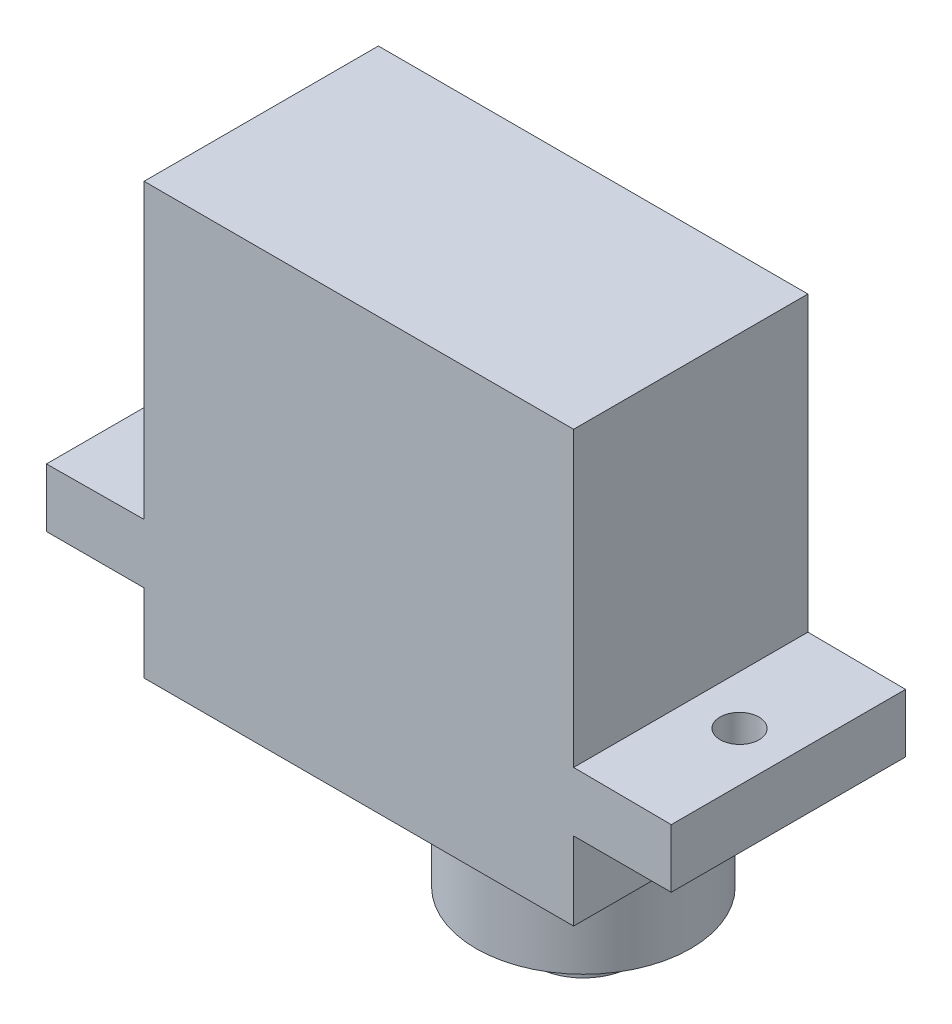
ISO-10303-21;
HEADER;
FILE_DESCRIPTION(('STEP AP214'),'2;1');
FILE_NAME('part.step','',(''),(''),'','','');
FILE_SCHEMA(('AUTOMOTIVE_DESIGN { 1 0 10303 214 1 1 1 1 }'));
ENDSEC;
DATA;
#1=APPLICATION_CONTEXT('core data for automotive mechanical design processes');
#2=APPLICATION_PROTOCOL_DEFINITION('international standard','automotive_design',2000,#1);
#3=PRODUCT_CONTEXT('',#1,'mechanical');
#4=PRODUCT('Part','Part','',(#3));
#5=PRODUCT_RELATED_PRODUCT_CATEGORY('part','',(#4));
#6=PRODUCT_DEFINITION_FORMATION('','',#4);
#7=PRODUCT_DEFINITION_CONTEXT('part definition',#1,'design');
#8=PRODUCT_DEFINITION('design','',#6,#7);
#9=PRODUCT_DEFINITION_SHAPE('','',#8);
#10=(LENGTH_UNIT() NAMED_UNIT(*) SI_UNIT(.MILLI.,.METRE.));
#11=(NAMED_UNIT(*) PLANE_ANGLE_UNIT() SI_UNIT($,.RADIAN.));
#12=(NAMED_UNIT(*) SI_UNIT($,.STERADIAN.) SOLID_ANGLE_UNIT());
#13=UNCERTAINTY_MEASURE_WITH_UNIT(LENGTH_MEASURE(1.E-05),#10,'distance_accuracy_value','');
#14=(GEOMETRIC_REPRESENTATION_CONTEXT(3) GLOBAL_UNCERTAINTY_ASSIGNED_CONTEXT((#13)) GLOBAL_UNIT_ASSIGNED_CONTEXT((#10,
#11,#12)) REPRESENTATION_CONTEXT('',''));
#15=CARTESIAN_POINT('',(0.,0.,0.));
#16=DIRECTION('',(0.,0.,1.));
#17=DIRECTION('',(1.,0.,0.));
#18=AXIS2_PLACEMENT_3D('',#15,#16,#17);
#19=CARTESIAN_POINT('',(11.,-7.5,12.));
#20=DIRECTION('',(-1.,0.,0.));
#21=DIRECTION('',(0.,0.,1.));
#22=AXIS2_PLACEMENT_3D('',#19,#20,#21);
#23=PLANE('',#22);
#24=DIRECTION('',(0.,1.,0.));
#25=VECTOR('',#24,1.);
#26=CARTESIAN_POINT('',(11.,-7.5,0.));
#27=LINE('',#26,#25);
#28=CARTESIAN_POINT('',(11.,-7.5,0.));
#29=VERTEX_POINT('',#28);
#30=CARTESIAN_POINT('',(11.,7.5,0.));
#31=VERTEX_POINT('',#30);
#32=EDGE_CURVE('E154',#29,#31,#27,.T.);
#33=ORIENTED_EDGE('',*,*,#32,.T.);
#34=DIRECTION('',(0.,0.,-1.));
#35=VECTOR('',#34,1.);
#36=CARTESIAN_POINT('',(11.,7.5,12.));
#37=LINE('',#36,#35);
#38=CARTESIAN_POINT('',(11.,7.5,12.));
#39=VERTEX_POINT('',#38);
#40=EDGE_CURVE('E12',#39,#31,#37,.T.);
#41=ORIENTED_EDGE('',*,*,#40,.F.);
#42=DIRECTION('',(0.,1.,0.));
#43=VECTOR('',#42,1.);
#44=CARTESIAN_POINT('',(11.,-7.5,12.));
#45=LINE('',#44,#43);
#46=CARTESIAN_POINT('',(11.,-7.5,12.));
#47=VERTEX_POINT('',#46);
#48=EDGE_CURVE('E178',#47,#39,#45,.T.);
#49=ORIENTED_EDGE('',*,*,#48,.F.);
#50=DIRECTION('',(0.,0.,-1.));
#51=VECTOR('',#50,1.);
#52=CARTESIAN_POINT('',(11.,-7.5,12.));
#53=LINE('',#52,#51);
#54=EDGE_CURVE('E150',#47,#29,#53,.T.);
#55=ORIENTED_EDGE('',*,*,#54,.T.);
#56=EDGE_LOOP('',(#33,#41,#49,#55));
#57=FACE_BOUND('',#56,.T.);
#58=ADVANCED_FACE('F35',(#57),#23,.F.);
#59=CARTESIAN_POINT('',(-11.,7.5,12.));
#60=DIRECTION('',(0.,-1.,0.));
#61=DIRECTION('',(0.,0.,-1.));
#62=AXIS2_PLACEMENT_3D('',#59,#60,#61);
#63=PLANE('',#62);
#64=DIRECTION('',(-1.,0.,0.));
#65=VECTOR('',#64,1.);
#66=CARTESIAN_POINT('',(-11.,7.5,0.));
#67=LINE('',#66,#65);
#68=CARTESIAN_POINT('',(-11.,7.5,0.));
#69=VERTEX_POINT('',#68);
#70=EDGE_CURVE('E157',#31,#69,#67,.T.);
#71=ORIENTED_EDGE('',*,*,#70,.T.);
#72=DIRECTION('',(0.,0.,-1.));
#73=VECTOR('',#72,1.);
#74=CARTESIAN_POINT('',(-11.,7.5,12.));
#75=LINE('',#74,#73);
#76=CARTESIAN_POINT('',(-11.,7.5,12.));
#77=VERTEX_POINT('',#76);
#78=EDGE_CURVE('E44',#77,#69,#75,.T.);
#79=ORIENTED_EDGE('',*,*,#78,.F.);
#80=DIRECTION('',(-1.,0.,0.));
#81=VECTOR('',#80,1.);
#82=CARTESIAN_POINT('',(-11.,7.5,12.));
#83=LINE('',#82,#81);
#84=EDGE_CURVE('E105',#39,#77,#83,.T.);
#85=ORIENTED_EDGE('',*,*,#84,.F.);
#86=ORIENTED_EDGE('',*,*,#40,.T.);
#87=EDGE_LOOP('',(#71,#79,#85,#86));
#88=FACE_BOUND('',#87,.T.);
#89=ADVANCED_FACE('F267',(#88),#63,.F.);
#90=CARTESIAN_POINT('',(-11.,-7.5,12.));
#91=DIRECTION('',(1.,0.,0.));
#92=DIRECTION('',(0.,0.,-1.));
#93=AXIS2_PLACEMENT_3D('',#90,#91,#92);
#94=PLANE('',#93);
#95=DIRECTION('',(0.,-1.,0.));
#96=VECTOR('',#95,1.);
#97=CARTESIAN_POINT('',(-11.,-7.5,0.));
#98=LINE('',#97,#96);
#99=CARTESIAN_POINT('',(-11.,-7.5,0.));
#100=VERTEX_POINT('',#99);
#101=EDGE_CURVE('E160',#69,#100,#98,.T.);
#102=ORIENTED_EDGE('',*,*,#101,.T.);
#103=DIRECTION('',(0.,0.,-1.));
#104=VECTOR('',#103,1.);
#105=CARTESIAN_POINT('',(-11.,-7.5,12.));
#106=LINE('',#105,#104);
#107=CARTESIAN_POINT('',(-11.,-7.5,12.));
#108=VERTEX_POINT('',#107);
#109=EDGE_CURVE('E194',#108,#100,#106,.T.);
#110=ORIENTED_EDGE('',*,*,#109,.F.);
#111=DIRECTION('',(0.,-1.,0.));
#112=VECTOR('',#111,1.);
#113=CARTESIAN_POINT('',(-11.,-7.5,12.));
#114=LINE('',#113,#112);
#115=EDGE_CURVE('E203',#77,#108,#114,.T.);
#116=ORIENTED_EDGE('',*,*,#115,.F.);
#117=ORIENTED_EDGE('',*,*,#78,.T.);
#118=EDGE_LOOP('',(#102,#110,#116,#117));
#119=FACE_BOUND('',#118,.T.);
#120=ADVANCED_FACE('F201',(#119),#94,.F.);
#121=CARTESIAN_POINT('',(-16.,-7.53701079560618,12.));
#122=DIRECTION('',(0.00740195634016767,-0.99997260514593,0.));
#123=DIRECTION('',(0.99997260514593,0.00740195634016767,0.));
#124=AXIS2_PLACEMENT_3D('',#121,#122,#123);
#125=PLANE('',#124);
#126=CARTESIAN_POINT('',(-13.5,-7.51850539780309,6.));
#127=DIRECTION('',(0.00740195634016767,-0.99997260514593,0.));
#128=DIRECTION('',(-0.99997260514593,-0.00740195634016767,0.));
#129=AXIS2_PLACEMENT_3D('',#126,#127,#128);
#130=ELLIPSE('',#129,1.00002739560457,1.);
#131=CARTESIAN_POINT('',(-14.5,-7.52590755692433,6.));
#132=VERTEX_POINT('',#131);
#133=EDGE_CURVE('E317',#132,#132,#130,.T.);
#134=ORIENTED_EDGE('',*,*,#133,.T.);
#135=EDGE_LOOP('',(#134));
#136=FACE_BOUND('',#135,.T.);
#137=DIRECTION('',(-0.99997260514593,-0.00740195634016767,0.));
#138=VECTOR('',#137,1.);
#139=CARTESIAN_POINT('',(-16.,-7.53701079560618,0.));
#140=LINE('',#139,#138);
#141=CARTESIAN_POINT('',(-16.,-7.53701079560618,0.));
#142=VERTEX_POINT('',#141);
#143=EDGE_CURVE('E162',#100,#142,#140,.T.);
#144=ORIENTED_EDGE('',*,*,#143,.T.);
#145=DIRECTION('',(0.,0.,-1.));
#146=VECTOR('',#145,1.);
#147=CARTESIAN_POINT('',(-16.,-7.53701079560618,12.));
#148=LINE('',#147,#146);
#149=CARTESIAN_POINT('',(-16.,-7.53701079560618,12.));
#150=VERTEX_POINT('',#149);
#151=EDGE_CURVE('E191',#150,#142,#148,.T.);
#152=ORIENTED_EDGE('',*,*,#151,.F.);
#153=DIRECTION('',(-0.99997260514593,-0.00740195634016767,0.));
#154=VECTOR('',#153,1.);
#155=CARTESIAN_POINT('',(-16.,-7.53701079560618,12.));
#156=LINE('',#155,#154);
#157=EDGE_CURVE('E222',#108,#150,#156,.T.);
#158=ORIENTED_EDGE('',*,*,#157,.F.);
#159=ORIENTED_EDGE('',*,*,#109,.T.);
#160=EDGE_LOOP('',(#144,#152,#158,#159));
#161=FACE_BOUND('',#160,.T.);
#162=ADVANCED_FACE('F213',(#136,#161),#125,.F.);
#163=CARTESIAN_POINT('',(-16.,-7.53701079560618,12.));
#164=DIRECTION('',(1.,0.,0.));
#165=DIRECTION('',(0.,0.,-1.));
#166=AXIS2_PLACEMENT_3D('',#163,#164,#165);
#167=PLANE('',#166);
#168=DIRECTION('',(0.,-1.,0.));
#169=VECTOR('',#168,1.);
#170=CARTESIAN_POINT('',(-16.,-7.53701079560618,0.));
#171=LINE('',#170,#169);
#172=CARTESIAN_POINT('',(-16.,-10.5370107956062,0.));
#173=VERTEX_POINT('',#172);
#174=EDGE_CURVE('E164',#142,#173,#171,.T.);
#175=ORIENTED_EDGE('',*,*,#174,.T.);
#176=DIRECTION('',(0.,0.,-1.));
#177=VECTOR('',#176,1.);
#178=CARTESIAN_POINT('',(-16.,-10.5370107956062,12.));
#179=LINE('',#178,#177);
#180=CARTESIAN_POINT('',(-16.,-10.5370107956062,12.));
#181=VERTEX_POINT('',#180);
#182=EDGE_CURVE('E188',#181,#173,#179,.T.);
#183=ORIENTED_EDGE('',*,*,#182,.F.);
#184=DIRECTION('',(0.,-1.,0.));
#185=VECTOR('',#184,1.);
#186=CARTESIAN_POINT('',(-16.,-7.53701079560618,12.));
#187=LINE('',#186,#185);
#188=EDGE_CURVE('E219',#150,#181,#187,.T.);
#189=ORIENTED_EDGE('',*,*,#188,.F.);
#190=ORIENTED_EDGE('',*,*,#151,.T.);
#191=EDGE_LOOP('',(#175,#183,#189,#190));
#192=FACE_BOUND('',#191,.T.);
#193=ADVANCED_FACE('F217',(#192),#167,.F.);
#194=CARTESIAN_POINT('',(-16.,-10.5370107956062,12.));
#195=DIRECTION('',(0.,1.,0.));
#196=DIRECTION('',(-1.,0.,0.));
#197=AXIS2_PLACEMENT_3D('',#194,#195,#196);
#198=PLANE('',#197);
#199=CARTESIAN_POINT('',(-13.5,-10.5370107956062,6.));
#200=DIRECTION('',(0.,-1.,0.));
#201=DIRECTION('',(1.,0.,0.));
#202=AXIS2_PLACEMENT_3D('',#199,#200,#201);
#203=CIRCLE('',#202,1.);
#204=CARTESIAN_POINT('',(-12.5,-10.5370107956062,6.));
#205=VERTEX_POINT('',#204);
#206=EDGE_CURVE('E313',#205,#205,#203,.T.);
#207=ORIENTED_EDGE('',*,*,#206,.F.);
#208=EDGE_LOOP('',(#207));
#209=FACE_BOUND('',#208,.T.);
#210=DIRECTION('',(1.,0.,0.));
#211=VECTOR('',#210,1.);
#212=CARTESIAN_POINT('',(-16.,-10.5370107956062,0.));
#213=LINE('',#212,#211);
#214=CARTESIAN_POINT('',(-11.,-10.5370107956062,0.));
#215=VERTEX_POINT('',#214);
#216=EDGE_CURVE('E166',#173,#215,#213,.T.);
#217=ORIENTED_EDGE('',*,*,#216,.T.);
#218=DIRECTION('',(0.,0.,-1.));
#219=VECTOR('',#218,1.);
#220=CARTESIAN_POINT('',(-11.,-10.5370107956062,12.));
#221=LINE('',#220,#219);
#222=CARTESIAN_POINT('',(-11.,-10.5370107956062,12.));
#223=VERTEX_POINT('',#222);
#224=EDGE_CURVE('E185',#223,#215,#221,.T.);
#225=ORIENTED_EDGE('',*,*,#224,.F.);
#226=DIRECTION('',(1.,0.,0.));
#227=VECTOR('',#226,1.);
#228=CARTESIAN_POINT('',(-16.,-10.5370107956062,12.));
#229=LINE('',#228,#227);
#230=EDGE_CURVE('E221',#181,#223,#229,.T.);
#231=ORIENTED_EDGE('',*,*,#230,.F.);
#232=ORIENTED_EDGE('',*,*,#182,.T.);
#233=EDGE_LOOP('',(#217,#225,#231,#232));
#234=FACE_BOUND('',#233,.T.);
#235=ADVANCED_FACE('F281',(#209,#234),#198,.F.);
#236=CARTESIAN_POINT('',(-11.,-10.5370107956062,12.));
#237=DIRECTION('',(1.,0.,0.));
#238=DIRECTION('',(0.,1.,0.));
#239=AXIS2_PLACEMENT_3D('',#236,#237,#238);
#240=PLANE('',#239);
#241=DIRECTION('',(0.,-1.,0.));
#242=VECTOR('',#241,1.);
#243=CARTESIAN_POINT('',(-11.,-10.5370107956062,0.));
#244=LINE('',#243,#242);
#245=CARTESIAN_POINT('',(-11.,-14.5370107956062,0.));
#246=VERTEX_POINT('',#245);
#247=EDGE_CURVE('E168',#215,#246,#244,.T.);
#248=ORIENTED_EDGE('',*,*,#247,.T.);
#249=DIRECTION('',(0.,0.,-1.));
#250=VECTOR('',#249,1.);
#251=CARTESIAN_POINT('',(-11.,-14.5370107956062,12.));
#252=LINE('',#251,#250);
#253=CARTESIAN_POINT('',(-11.,-14.5370107956062,12.));
#254=VERTEX_POINT('',#253);
#255=EDGE_CURVE('E182',#254,#246,#252,.T.);
#256=ORIENTED_EDGE('',*,*,#255,.F.);
#257=DIRECTION('',(0.,-1.,0.));
#258=VECTOR('',#257,1.);
#259=CARTESIAN_POINT('',(-11.,-10.5370107956062,12.));
#260=LINE('',#259,#258);
#261=EDGE_CURVE('E224',#223,#254,#260,.T.);
#262=ORIENTED_EDGE('',*,*,#261,.F.);
#263=ORIENTED_EDGE('',*,*,#224,.T.);
#264=EDGE_LOOP('',(#248,#256,#262,#263));
#265=FACE_BOUND('',#264,.T.);
#266=ADVANCED_FACE('F284',(#265),#240,.F.);
#267=CARTESIAN_POINT('',(0.,-14.5370107956062,12.));
#268=DIRECTION('',(0.,1.,0.));
#269=DIRECTION('',(-1.,0.,0.));
#270=AXIS2_PLACEMENT_3D('',#267,#268,#269);
#271=PLANE('',#270);
#272=DIRECTION('',(1.,0.,0.));
#273=VECTOR('',#272,1.);
#274=CARTESIAN_POINT('',(0.,-14.5370107956062,0.));
#275=LINE('',#274,#273);
#276=CARTESIAN_POINT('',(11.,-14.5370107956062,0.));
#277=VERTEX_POINT('',#276);
#278=EDGE_CURVE('E170',#246,#277,#275,.T.);
#279=ORIENTED_EDGE('',*,*,#278,.T.);
#280=DIRECTION('',(0.,0.,-1.));
#281=VECTOR('',#280,1.);
#282=CARTESIAN_POINT('',(11.,-14.5370107956062,12.));
#283=LINE('',#282,#281);
#284=CARTESIAN_POINT('',(11.,-14.5370107956062,6.));
#285=VERTEX_POINT('',#284);
#286=EDGE_CURVE('E247',#285,#277,#283,.T.);
#287=ORIENTED_EDGE('',*,*,#286,.F.);
#288=CARTESIAN_POINT('',(5.50000000000001,-14.5370107956062,6.));
#289=DIRECTION('',(0.,1.,0.));
#290=DIRECTION('',(-1.,0.,0.));
#291=AXIS2_PLACEMENT_3D('',#288,#289,#290);
#292=CIRCLE('',#291,5.5);
#293=EDGE_CURVE('E244',#285,#285,#292,.F.);
#294=ORIENTED_EDGE('',*,*,#293,.F.);
#295=CARTESIAN_POINT('',(11.,-14.5370107956062,12.));
#296=VERTEX_POINT('',#295);
#297=EDGE_CURVE('E239',#296,#285,#283,.T.);
#298=ORIENTED_EDGE('',*,*,#297,.F.);
#299=DIRECTION('',(1.,0.,0.));
#300=VECTOR('',#299,1.);
#301=CARTESIAN_POINT('',(0.,-14.5370107956062,12.));
#302=LINE('',#301,#300);
#303=EDGE_CURVE('E230',#254,#296,#302,.T.);
#304=ORIENTED_EDGE('',*,*,#303,.F.);
#305=ORIENTED_EDGE('',*,*,#255,.T.);
#306=EDGE_LOOP('',(#279,#287,#294,#298,#304,#305));
#307=FACE_BOUND('',#306,.T.);
#308=ADVANCED_FACE('F240',(#307),#271,.F.);
#309=CARTESIAN_POINT('',(11.,-10.5370107956062,12.));
#310=DIRECTION('',(-1.,0.,0.));
#311=DIRECTION('',(0.,-1.,0.));
#312=AXIS2_PLACEMENT_3D('',#309,#310,#311);
#313=PLANE('',#312);
#314=DIRECTION('',(0.,1.,0.));
#315=VECTOR('',#314,1.);
#316=CARTESIAN_POINT('',(11.,-14.5370107956062,12.));
#317=LINE('',#316,#315);
#318=CARTESIAN_POINT('',(11.,-10.5370107956062,12.));
#319=VERTEX_POINT('',#318);
#320=EDGE_CURVE('E136',#296,#319,#317,.T.);
#321=ORIENTED_EDGE('',*,*,#320,.F.);
#322=ORIENTED_EDGE('',*,*,#297,.T.);
#323=ORIENTED_EDGE('',*,*,#286,.T.);
#324=DIRECTION('',(0.,1.,0.));
#325=VECTOR('',#324,1.);
#326=CARTESIAN_POINT('',(11.,-10.5370107956062,0.));
#327=LINE('',#326,#325);
#328=CARTESIAN_POINT('',(11.,-10.5370107956062,0.));
#329=VERTEX_POINT('',#328);
#330=EDGE_CURVE('E173',#277,#329,#327,.T.);
#331=ORIENTED_EDGE('',*,*,#330,.T.);
#332=DIRECTION('',(0.,0.,-1.));
#333=VECTOR('',#332,1.);
#334=CARTESIAN_POINT('',(11.,-10.5370107956062,12.));
#335=LINE('',#334,#333);
#336=EDGE_CURVE('E145',#319,#329,#335,.T.);
#337=ORIENTED_EDGE('',*,*,#336,.F.);
#338=EDGE_LOOP('',(#321,#322,#323,#331,#337));
#339=FACE_BOUND('',#338,.T.);
#340=ADVANCED_FACE('F249',(#339),#313,.F.);
#341=CARTESIAN_POINT('',(11.,-10.5370107956062,12.));
#342=DIRECTION('',(0.,1.,0.));
#343=DIRECTION('',(-1.,0.,0.));
#344=AXIS2_PLACEMENT_3D('',#341,#342,#343);
#345=PLANE('',#344);
#346=CARTESIAN_POINT('',(13.5,-10.5370107956062,6.));
#347=DIRECTION('',(0.,-1.,0.));
#348=DIRECTION('',(-1.,0.,0.));
#349=AXIS2_PLACEMENT_3D('',#346,#347,#348);
#350=CIRCLE('',#349,1.);
#351=CARTESIAN_POINT('',(12.5,-10.5370107956062,6.));
#352=VERTEX_POINT('',#351);
#353=EDGE_CURVE('E310',#352,#352,#350,.T.);
#354=ORIENTED_EDGE('',*,*,#353,.F.);
#355=EDGE_LOOP('',(#354));
#356=FACE_BOUND('',#355,.T.);
#357=DIRECTION('',(1.,0.,0.));
#358=VECTOR('',#357,1.);
#359=CARTESIAN_POINT('',(11.,-10.5370107956062,0.));
#360=LINE('',#359,#358);
#361=CARTESIAN_POINT('',(16.,-10.5370107956062,0.));
#362=VERTEX_POINT('',#361);
#363=EDGE_CURVE('E144',#329,#362,#360,.T.);
#364=ORIENTED_EDGE('',*,*,#363,.T.);
#365=DIRECTION('',(0.,0.,-1.));
#366=VECTOR('',#365,1.);
#367=CARTESIAN_POINT('',(16.,-10.5370107956062,12.));
#368=LINE('',#367,#366);
#369=CARTESIAN_POINT('',(16.,-10.5370107956062,12.));
#370=VERTEX_POINT('',#369);
#371=EDGE_CURVE('E141',#370,#362,#368,.T.);
#372=ORIENTED_EDGE('',*,*,#371,.F.);
#373=DIRECTION('',(1.,0.,0.));
#374=VECTOR('',#373,1.);
#375=CARTESIAN_POINT('',(11.,-10.5370107956062,12.));
#376=LINE('',#375,#374);
#377=EDGE_CURVE('E129',#319,#370,#376,.T.);
#378=ORIENTED_EDGE('',*,*,#377,.F.);
#379=ORIENTED_EDGE('',*,*,#336,.T.);
#380=EDGE_LOOP('',(#364,#372,#378,#379));
#381=FACE_BOUND('',#380,.T.);
#382=ADVANCED_FACE('F142',(#356,#381),#345,.F.);
#383=CARTESIAN_POINT('',(16.,-7.53701079560618,12.));
#384=DIRECTION('',(-1.,0.,0.));
#385=DIRECTION('',(0.,0.,1.));
#386=AXIS2_PLACEMENT_3D('',#383,#384,#385);
#387=PLANE('',#386);
#388=DIRECTION('',(0.,1.,0.));
#389=VECTOR('',#388,1.);
#390=CARTESIAN_POINT('',(16.,-7.53701079560618,0.));
#391=LINE('',#390,#389);
#392=CARTESIAN_POINT('',(16.,-7.53701079560618,0.));
#393=VERTEX_POINT('',#392);
#394=EDGE_CURVE('E91',#362,#393,#391,.T.);
#395=ORIENTED_EDGE('',*,*,#394,.T.);
#396=DIRECTION('',(0.,0.,-1.));
#397=VECTOR('',#396,1.);
#398=CARTESIAN_POINT('',(16.,-7.53701079560618,12.));
#399=LINE('',#398,#397);
#400=CARTESIAN_POINT('',(16.,-7.53701079560618,12.));
#401=VERTEX_POINT('',#400);
#402=EDGE_CURVE('E146',#401,#393,#399,.T.);
#403=ORIENTED_EDGE('',*,*,#402,.F.);
#404=DIRECTION('',(0.,1.,0.));
#405=VECTOR('',#404,1.);
#406=CARTESIAN_POINT('',(16.,-7.53701079560618,12.));
#407=LINE('',#406,#405);
#408=EDGE_CURVE('E134',#370,#401,#407,.T.);
#409=ORIENTED_EDGE('',*,*,#408,.F.);
#410=ORIENTED_EDGE('',*,*,#371,.T.);
#411=EDGE_LOOP('',(#395,#403,#409,#410));
#412=FACE_BOUND('',#411,.T.);
#413=ADVANCED_FACE('F148',(#412),#387,.F.);
#414=CARTESIAN_POINT('',(11.,-7.5,12.));
#415=DIRECTION('',(-0.00740195634016681,-0.99997260514593,0.));
#416=DIRECTION('',(0.99997260514593,-0.00740195634016682,0.));
#417=AXIS2_PLACEMENT_3D('',#414,#415,#416);
#418=PLANE('',#417);
#419=CARTESIAN_POINT('',(13.5,-7.51850539780309,6.));
#420=DIRECTION('',(-0.00740195634016681,-0.99997260514593,0.));
#421=DIRECTION('',(0.99997260514593,-0.00740195634016682,0.));
#422=AXIS2_PLACEMENT_3D('',#419,#420,#421);
#423=ELLIPSE('',#422,1.00002739560457,1.);
#424=CARTESIAN_POINT('',(14.5,-7.52590755692432,6.));
#425=VERTEX_POINT('',#424);
#426=EDGE_CURVE('E38',#425,#425,#423,.T.);
#427=ORIENTED_EDGE('',*,*,#426,.T.);
#428=EDGE_LOOP('',(#427));
#429=FACE_BOUND('',#428,.T.);
#430=DIRECTION('',(-0.99997260514593,0.00740195634016682,0.));
#431=VECTOR('',#430,1.);
#432=CARTESIAN_POINT('',(11.,-7.5,0.));
#433=LINE('',#432,#431);
#434=EDGE_CURVE('E97',#393,#29,#433,.T.);
#435=ORIENTED_EDGE('',*,*,#434,.T.);
#436=ORIENTED_EDGE('',*,*,#54,.F.);
#437=DIRECTION('',(-0.99997260514593,0.00740195634016682,0.));
#438=VECTOR('',#437,1.);
#439=CARTESIAN_POINT('',(11.,-7.5,12.));
#440=LINE('',#439,#438);
#441=EDGE_CURVE('E52',#401,#47,#440,.T.);
#442=ORIENTED_EDGE('',*,*,#441,.F.);
#443=ORIENTED_EDGE('',*,*,#402,.T.);
#444=EDGE_LOOP('',(#435,#436,#442,#443));
#445=FACE_BOUND('',#444,.T.);
#446=ADVANCED_FACE('F254',(#429,#445),#418,.F.);
#447=CARTESIAN_POINT('',(0.,0.,12.));
#448=DIRECTION('',(0.,0.,-1.));
#449=DIRECTION('',(-1.,0.,0.));
#450=AXIS2_PLACEMENT_3D('',#447,#448,#449);
#451=PLANE('',#450);
#452=ORIENTED_EDGE('',*,*,#303,.T.);
#453=ORIENTED_EDGE('',*,*,#320,.T.);
#454=ORIENTED_EDGE('',*,*,#377,.T.);
#455=ORIENTED_EDGE('',*,*,#408,.T.);
#456=ORIENTED_EDGE('',*,*,#441,.T.);
#457=ORIENTED_EDGE('',*,*,#48,.T.);
#458=ORIENTED_EDGE('',*,*,#84,.T.);
#459=ORIENTED_EDGE('',*,*,#115,.T.);
#460=ORIENTED_EDGE('',*,*,#157,.T.);
#461=ORIENTED_EDGE('',*,*,#188,.T.);
#462=ORIENTED_EDGE('',*,*,#230,.T.);
#463=ORIENTED_EDGE('',*,*,#261,.T.);
#464=EDGE_LOOP('',(#452,#453,#454,#455,#456,#457,#458,#459,#460,#461,#462,#463));
#465=FACE_BOUND('',#464,.T.);
#466=ADVANCED_FACE('F132',(#465),#451,.F.);
#467=CARTESIAN_POINT('',(0.,0.,0.));
#468=DIRECTION('',(0.,0.,-1.));
#469=DIRECTION('',(-1.,0.,0.));
#470=AXIS2_PLACEMENT_3D('',#467,#468,#469);
#471=PLANE('',#470);
#472=ORIENTED_EDGE('',*,*,#330,.F.);
#473=ORIENTED_EDGE('',*,*,#278,.F.);
#474=ORIENTED_EDGE('',*,*,#247,.F.);
#475=ORIENTED_EDGE('',*,*,#216,.F.);
#476=ORIENTED_EDGE('',*,*,#174,.F.);
#477=ORIENTED_EDGE('',*,*,#143,.F.);
#478=ORIENTED_EDGE('',*,*,#101,.F.);
#479=ORIENTED_EDGE('',*,*,#70,.F.);
#480=ORIENTED_EDGE('',*,*,#32,.F.);
#481=ORIENTED_EDGE('',*,*,#434,.F.);
#482=ORIENTED_EDGE('',*,*,#394,.F.);
#483=ORIENTED_EDGE('',*,*,#363,.F.);
#484=EDGE_LOOP('',(#472,#473,#474,#475,#476,#477,#478,#479,#480,#481,#482,#483));
#485=FACE_BOUND('',#484,.T.);
#486=ADVANCED_FACE('F207',(#485),#471,.T.);
#487=CARTESIAN_POINT('',(5.50000000000001,21.2712229300653,6.));
#488=DIRECTION('',(0.,-1.,0.));
#489=DIRECTION('',(0.,0.,-1.));
#490=AXIS2_PLACEMENT_3D('',#487,#488,#489);
#491=CYLINDRICAL_SURFACE('',#490,5.5);
#492=CARTESIAN_POINT('',(5.50000000000001,-18.5370107956062,6.));
#493=DIRECTION('',(0.,1.,0.));
#494=DIRECTION('',(0.,0.,1.));
#495=AXIS2_PLACEMENT_3D('',#492,#493,#494);
#496=CIRCLE('',#495,5.5);
#497=CARTESIAN_POINT('',(5.50000000000001,-18.5370107956062,11.5));
#498=VERTEX_POINT('',#497);
#499=EDGE_CURVE('E158',#498,#498,#496,.T.);
#500=ORIENTED_EDGE('',*,*,#499,.T.);
#501=EDGE_LOOP('',(#500));
#502=FACE_BOUND('',#501,.T.);
#503=ORIENTED_EDGE('',*,*,#293,.T.);
#504=EDGE_LOOP('',(#503));
#505=FACE_BOUND('',#504,.T.);
#506=ADVANCED_FACE('F300',(#502,#505),#491,.T.);
#507=CARTESIAN_POINT('',(11.,-18.5370107956062,12.));
#508=DIRECTION('',(0.,1.,0.));
#509=DIRECTION('',(0.,0.,1.));
#510=AXIS2_PLACEMENT_3D('',#507,#508,#509);
#511=PLANE('',#510);
#512=CARTESIAN_POINT('',(5.50000000000001,-18.5370107956062,6.));
#513=DIRECTION('',(0.,1.,0.));
#514=DIRECTION('',(0.,0.,1.));
#515=AXIS2_PLACEMENT_3D('',#512,#513,#514);
#516=CIRCLE('',#515,2.5);
#517=CARTESIAN_POINT('',(5.50000000000001,-18.5370107956062,8.5));
#518=VERTEX_POINT('',#517);
#519=EDGE_CURVE('E323',#518,#518,#516,.F.);
#520=ORIENTED_EDGE('',*,*,#519,.F.);
#521=EDGE_LOOP('',(#520));
#522=FACE_BOUND('',#521,.T.);
#523=ORIENTED_EDGE('',*,*,#499,.F.);
#524=EDGE_LOOP('',(#523));
#525=FACE_BOUND('',#524,.T.);
#526=ADVANCED_FACE('F297',(#522,#525),#511,.F.);
#527=CARTESIAN_POINT('',(5.50000000000001,17.2712229300653,6.));
#528=DIRECTION('',(0.,-1.,0.));
#529=DIRECTION('',(0.,0.,-1.));
#530=AXIS2_PLACEMENT_3D('',#527,#528,#529);
#531=CYLINDRICAL_SURFACE('',#530,2.5);
#532=CARTESIAN_POINT('',(5.50000000000001,-20.8225256290589,6.));
#533=DIRECTION('',(0.,-1.,0.));
#534=DIRECTION('',(0.,0.,-1.));
#535=AXIS2_PLACEMENT_3D('',#532,#533,#534);
#536=CIRCLE('',#535,2.5);
#537=CARTESIAN_POINT('',(5.50000000000001,-20.8225256290589,3.5));
#538=VERTEX_POINT('',#537);
#539=EDGE_CURVE('E320',#538,#538,#536,.T.);
#540=ORIENTED_EDGE('',*,*,#539,.F.);
#541=EDGE_LOOP('',(#540));
#542=FACE_BOUND('',#541,.T.);
#543=ORIENTED_EDGE('',*,*,#519,.T.);
#544=EDGE_LOOP('',(#543));
#545=FACE_BOUND('',#544,.T.);
#546=ADVANCED_FACE('F295',(#542,#545),#531,.T.);
#547=CARTESIAN_POINT('',(8.00000000000001,-20.8225256290589,12.));
#548=DIRECTION('',(0.,1.,0.));
#549=DIRECTION('',(0.,0.,1.));
#550=AXIS2_PLACEMENT_3D('',#547,#548,#549);
#551=PLANE('',#550);
#552=ORIENTED_EDGE('',*,*,#539,.T.);
#553=EDGE_LOOP('',(#552));
#554=FACE_BOUND('',#553,.T.);
#555=ADVANCED_FACE('F291',(#554),#551,.F.);
#556=CARTESIAN_POINT('',(-13.5,1.4629892043938,6.));
#557=DIRECTION('',(0.,-1.,0.));
#558=DIRECTION('',(1.,0.,0.));
#559=AXIS2_PLACEMENT_3D('',#556,#557,#558);
#560=CYLINDRICAL_SURFACE('',#559,1.);
#561=ORIENTED_EDGE('',*,*,#206,.T.);
#562=EDGE_LOOP('',(#561));
#563=FACE_BOUND('',#562,.T.);
#564=ORIENTED_EDGE('',*,*,#133,.F.);
#565=EDGE_LOOP('',(#564));
#566=FACE_BOUND('',#565,.T.);
#567=ADVANCED_FACE('F294',(#563,#566),#560,.F.);
#568=CARTESIAN_POINT('',(13.5,1.46298920439382,6.));
#569=DIRECTION('',(0.,-1.,0.));
#570=DIRECTION('',(1.,0.,0.));
#571=AXIS2_PLACEMENT_3D('',#568,#569,#570);
#572=CYLINDRICAL_SURFACE('',#571,1.);
#573=ORIENTED_EDGE('',*,*,#353,.T.);
#574=EDGE_LOOP('',(#573));
#575=FACE_BOUND('',#574,.T.);
#576=ORIENTED_EDGE('',*,*,#426,.F.);
#577=EDGE_LOOP('',(#576));
#578=FACE_BOUND('',#577,.T.);
#579=ADVANCED_FACE('F349',(#575,#578),#572,.F.);
#580=CLOSED_SHELL('',(#58,#89,#120,#162,#193,#235,#266,#308,#340,#382,#413,#446,#466,#486,#506,
#526,#546,#555,#567,#579));
#581=MANIFOLD_SOLID_BREP('B2',#580);
#582=ADVANCED_BREP_SHAPE_REPRESENTATION('',(#18,#581),#14);
#583=SHAPE_DEFINITION_REPRESENTATION(#9,#582);
ENDSEC;
END-ISO-10303-21;
